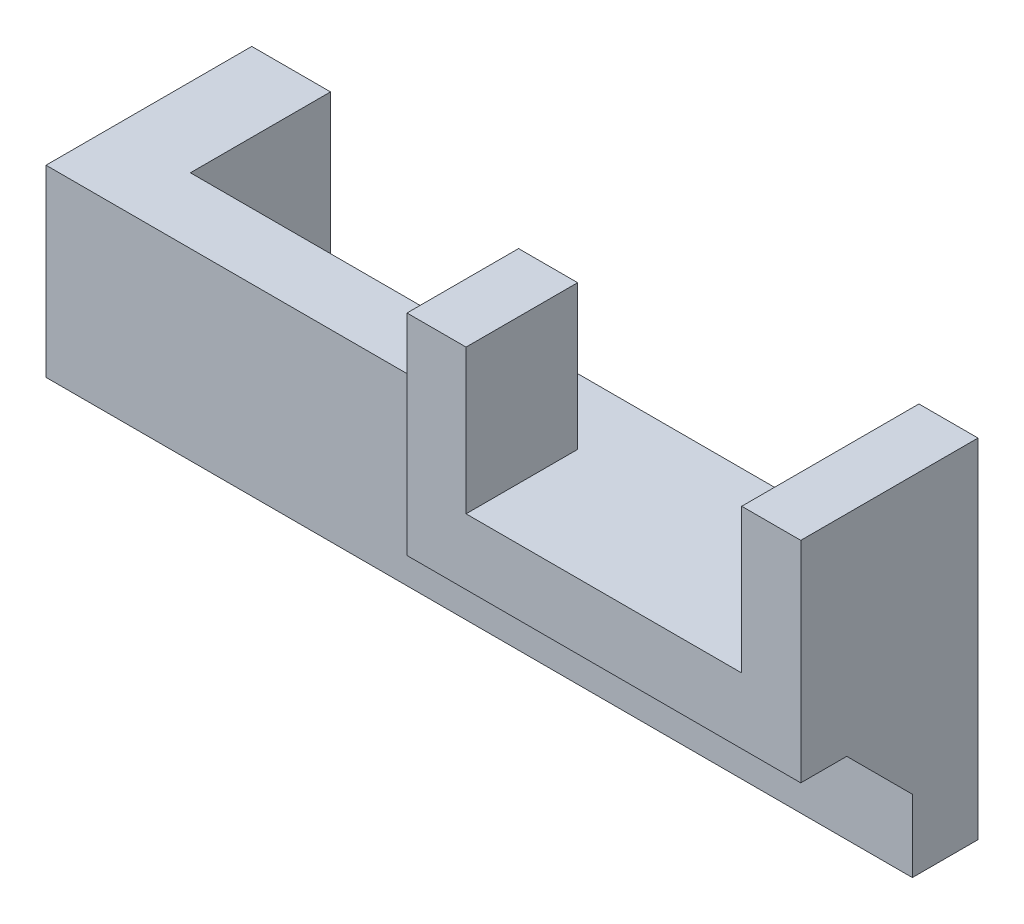
ISO-10303-21;
HEADER;
FILE_DESCRIPTION(('STEP AP214'),'2;1');
FILE_NAME('part.step','',(''),(''),'','','');
FILE_SCHEMA(('AUTOMOTIVE_DESIGN { 1 0 10303 214 1 1 1 1 }'));
ENDSEC;
DATA;
#1=APPLICATION_CONTEXT('core data for automotive mechanical design processes');
#2=APPLICATION_PROTOCOL_DEFINITION('international standard','automotive_design',2000,#1);
#3=PRODUCT_CONTEXT('',#1,'mechanical');
#4=PRODUCT('Part','Part','',(#3));
#5=PRODUCT_RELATED_PRODUCT_CATEGORY('part','',(#4));
#6=PRODUCT_DEFINITION_FORMATION('','',#4);
#7=PRODUCT_DEFINITION_CONTEXT('part definition',#1,'design');
#8=PRODUCT_DEFINITION('design','',#6,#7);
#9=PRODUCT_DEFINITION_SHAPE('','',#8);
#10=(LENGTH_UNIT() NAMED_UNIT(*) SI_UNIT(.MILLI.,.METRE.));
#11=(NAMED_UNIT(*) PLANE_ANGLE_UNIT() SI_UNIT($,.RADIAN.));
#12=(NAMED_UNIT(*) SI_UNIT($,.STERADIAN.) SOLID_ANGLE_UNIT());
#13=UNCERTAINTY_MEASURE_WITH_UNIT(LENGTH_MEASURE(1.E-05),#10,'distance_accuracy_value','');
#14=(GEOMETRIC_REPRESENTATION_CONTEXT(3) GLOBAL_UNCERTAINTY_ASSIGNED_CONTEXT((#13)) GLOBAL_UNIT_ASSIGNED_CONTEXT((#10,
#11,#12)) REPRESENTATION_CONTEXT('',''));
#15=CARTESIAN_POINT('',(0.,0.,0.));
#16=DIRECTION('',(0.,0.,1.));
#17=DIRECTION('',(1.,0.,0.));
#18=AXIS2_PLACEMENT_3D('',#15,#16,#17);
#19=CARTESIAN_POINT('',(132.,0.,-10.));
#20=DIRECTION('',(0.,0.,1.));
#21=DIRECTION('',(1.,0.,0.));
#22=AXIS2_PLACEMENT_3D('',#19,#20,#21);
#23=PLANE('',#22);
#24=DIRECTION('',(-1.,0.,0.));
#25=VECTOR('',#24,1.);
#26=CARTESIAN_POINT('',(132.,28.,-10.));
#27=LINE('',#26,#25);
#28=CARTESIAN_POINT('',(62.,28.,-10.));
#29=VERTEX_POINT('',#28);
#30=CARTESIAN_POINT('',(12.,28.,-10.));
#31=VERTEX_POINT('',#30);
#32=EDGE_CURVE('E216',#29,#31,#27,.T.);
#33=ORIENTED_EDGE('',*,*,#32,.F.);
#34=DIRECTION('',(0.707106781186544,0.707106781186551,0.));
#35=VECTOR('',#34,1.);
#36=CARTESIAN_POINT('',(82.9999999999997,48.9999999999998,-10.));
#37=LINE('',#36,#35);
#38=CARTESIAN_POINT('',(65.,31.,-10.));
#39=VERTEX_POINT('',#38);
#40=EDGE_CURVE('E304',#29,#39,#37,.T.);
#41=ORIENTED_EDGE('',*,*,#40,.T.);
#42=DIRECTION('',(1.,0.,0.));
#43=VECTOR('',#42,1.);
#44=CARTESIAN_POINT('',(132.,31.,-10.));
#45=LINE('',#44,#43);
#46=CARTESIAN_POINT('',(123.,31.,-10.));
#47=VERTEX_POINT('',#46);
#48=EDGE_CURVE('E63',#39,#47,#45,.T.);
#49=ORIENTED_EDGE('',*,*,#48,.T.);
#50=DIRECTION('',(0.,1.,0.));
#51=VECTOR('',#50,1.);
#52=CARTESIAN_POINT('',(123.,0.,-10.));
#53=LINE('',#52,#51);
#54=CARTESIAN_POINT('',(123.,53.,-10.));
#55=VERTEX_POINT('',#54);
#56=EDGE_CURVE('E187',#47,#55,#53,.T.);
#57=ORIENTED_EDGE('',*,*,#56,.T.);
#58=DIRECTION('',(-1.,0.,0.));
#59=VECTOR('',#58,1.);
#60=CARTESIAN_POINT('',(132.,53.,-10.));
#61=LINE('',#60,#59);
#62=CARTESIAN_POINT('',(132.,53.,-10.));
#63=VERTEX_POINT('',#62);
#64=EDGE_CURVE('E196',#63,#55,#61,.T.);
#65=ORIENTED_EDGE('',*,*,#64,.F.);
#66=DIRECTION('',(0.,1.,0.));
#67=VECTOR('',#66,1.);
#68=CARTESIAN_POINT('',(132.,0.,-10.));
#69=LINE('',#68,#67);
#70=CARTESIAN_POINT('',(132.,0.,-10.));
#71=VERTEX_POINT('',#70);
#72=EDGE_CURVE('E213',#71,#63,#69,.T.);
#73=ORIENTED_EDGE('',*,*,#72,.F.);
#74=DIRECTION('',(-1.,0.,0.));
#75=VECTOR('',#74,1.);
#76=CARTESIAN_POINT('',(132.,0.,-10.));
#77=LINE('',#76,#75);
#78=CARTESIAN_POINT('',(12.,0.,-10.));
#79=VERTEX_POINT('',#78);
#80=EDGE_CURVE('E222',#71,#79,#77,.T.);
#81=ORIENTED_EDGE('',*,*,#80,.T.);
#82=DIRECTION('',(0.,1.,0.));
#83=VECTOR('',#82,1.);
#84=CARTESIAN_POINT('',(12.,0.,-10.));
#85=LINE('',#84,#83);
#86=EDGE_CURVE('E204',#79,#31,#85,.T.);
#87=ORIENTED_EDGE('',*,*,#86,.T.);
#88=EDGE_LOOP('',(#33,#41,#49,#57,#65,#73,#81,#87));
#89=FACE_BOUND('',#88,.T.);
#90=ADVANCED_FACE('F41',(#89),#23,.F.);
#91=CARTESIAN_POINT('',(72.,28.,-10.));
#92=DIRECTION('',(-1.,0.,0.));
#93=DIRECTION('',(0.,0.,1.));
#94=AXIS2_PLACEMENT_3D('',#91,#92,#93);
#95=PLANE('',#94);
#96=DIRECTION('',(0.,-1.,0.));
#97=VECTOR('',#96,1.);
#98=CARTESIAN_POINT('',(72.,0.,0.));
#99=LINE('',#98,#97);
#100=CARTESIAN_POINT('',(72.,53.,0.));
#101=VERTEX_POINT('',#100);
#102=CARTESIAN_POINT('',(72.,38.0000000000001,0.));
#103=VERTEX_POINT('',#102);
#104=EDGE_CURVE('E167',#101,#103,#99,.T.);
#105=ORIENTED_EDGE('',*,*,#104,.T.);
#106=DIRECTION('',(0.,0.,1.));
#107=VECTOR('',#106,1.);
#108=CARTESIAN_POINT('',(72.,38.0000000000001,-10.));
#109=LINE('',#108,#107);
#110=CARTESIAN_POINT('',(72.,38.0000000000001,10.0000000000001));
#111=VERTEX_POINT('',#110);
#112=EDGE_CURVE('E290',#103,#111,#109,.T.);
#113=ORIENTED_EDGE('',*,*,#112,.T.);
#114=DIRECTION('',(0.,-1.,0.));
#115=VECTOR('',#114,1.);
#116=CARTESIAN_POINT('',(72.,28.,10.0000000000001));
#117=LINE('',#116,#115);
#118=CARTESIAN_POINT('',(72.,21.,10.));
#119=VERTEX_POINT('',#118);
#120=EDGE_CURVE('E273',#111,#119,#117,.T.);
#121=ORIENTED_EDGE('',*,*,#120,.T.);
#122=DIRECTION('',(0.,0.,-1.));
#123=VECTOR('',#122,1.);
#124=CARTESIAN_POINT('',(72.,21.,17.));
#125=LINE('',#124,#123);
#126=CARTESIAN_POINT('',(72.,21.,17.));
#127=VERTEX_POINT('',#126);
#128=EDGE_CURVE('E183',#127,#119,#125,.T.);
#129=ORIENTED_EDGE('',*,*,#128,.F.);
#130=DIRECTION('',(0.,-1.,0.));
#131=VECTOR('',#130,1.);
#132=CARTESIAN_POINT('',(72.,0.,17.));
#133=LINE('',#132,#131);
#134=CARTESIAN_POINT('',(72.,53.,17.));
#135=VERTEX_POINT('',#134);
#136=EDGE_CURVE('E294',#135,#127,#133,.T.);
#137=ORIENTED_EDGE('',*,*,#136,.F.);
#138=DIRECTION('',(0.,0.,1.));
#139=VECTOR('',#138,1.);
#140=CARTESIAN_POINT('',(72.,53.,-10.));
#141=LINE('',#140,#139);
#142=EDGE_CURVE('E201',#101,#135,#141,.T.);
#143=ORIENTED_EDGE('',*,*,#142,.F.);
#144=EDGE_LOOP('',(#105,#113,#121,#129,#137,#143));
#145=FACE_BOUND('',#144,.T.);
#146=ADVANCED_FACE('F317',(#145),#95,.T.);
#147=CARTESIAN_POINT('',(132.,53.,-10.));
#148=DIRECTION('',(0.,1.,0.));
#149=DIRECTION('',(-1.,0.,0.));
#150=AXIS2_PLACEMENT_3D('',#147,#148,#149);
#151=PLANE('',#150);
#152=DIRECTION('',(0.,0.,1.));
#153=VECTOR('',#152,1.);
#154=CARTESIAN_POINT('',(81.,53.,-10.));
#155=LINE('',#154,#153);
#156=CARTESIAN_POINT('',(81.,53.,0.));
#157=VERTEX_POINT('',#156);
#158=CARTESIAN_POINT('',(81.,53.,17.));
#159=VERTEX_POINT('',#158);
#160=EDGE_CURVE('E265',#157,#159,#155,.T.);
#161=ORIENTED_EDGE('',*,*,#160,.F.);
#162=DIRECTION('',(-1.,0.,0.));
#163=VECTOR('',#162,1.);
#164=CARTESIAN_POINT('',(81.,53.,0.));
#165=LINE('',#164,#163);
#166=EDGE_CURVE('E162',#157,#101,#165,.T.);
#167=ORIENTED_EDGE('',*,*,#166,.T.);
#168=ORIENTED_EDGE('',*,*,#142,.T.);
#169=DIRECTION('',(-1.,0.,0.));
#170=VECTOR('',#169,1.);
#171=CARTESIAN_POINT('',(0.,53.,17.));
#172=LINE('',#171,#170);
#173=EDGE_CURVE('E347',#159,#135,#172,.T.);
#174=ORIENTED_EDGE('',*,*,#173,.F.);
#175=EDGE_LOOP('',(#161,#167,#168,#174));
#176=FACE_BOUND('',#175,.T.);
#177=ADVANCED_FACE('F414',(#176),#151,.T.);
#178=CARTESIAN_POINT('',(81.,53.,-31.35));
#179=DIRECTION('',(-1.,0.,0.));
#180=DIRECTION('',(0.,0.,1.));
#181=AXIS2_PLACEMENT_3D('',#178,#179,#180);
#182=PLANE('',#181);
#183=DIRECTION('',(0.,-1.,0.));
#184=VECTOR('',#183,1.);
#185=CARTESIAN_POINT('',(81.,0.,0.));
#186=LINE('',#185,#184);
#187=CARTESIAN_POINT('',(81.,31.,0.));
#188=VERTEX_POINT('',#187);
#189=EDGE_CURVE('E159',#157,#188,#186,.T.);
#190=ORIENTED_EDGE('',*,*,#189,.F.);
#191=ORIENTED_EDGE('',*,*,#160,.T.);
#192=DIRECTION('',(0.,1.,0.));
#193=VECTOR('',#192,1.);
#194=CARTESIAN_POINT('',(81.,0.,17.));
#195=LINE('',#194,#193);
#196=CARTESIAN_POINT('',(81.,31.,17.));
#197=VERTEX_POINT('',#196);
#198=EDGE_CURVE('E180',#197,#159,#195,.T.);
#199=ORIENTED_EDGE('',*,*,#198,.F.);
#200=DIRECTION('',(0.,0.,1.));
#201=VECTOR('',#200,1.);
#202=CARTESIAN_POINT('',(81.,31.,-31.35));
#203=LINE('',#202,#201);
#204=EDGE_CURVE('E171',#188,#197,#203,.T.);
#205=ORIENTED_EDGE('',*,*,#204,.F.);
#206=EDGE_LOOP('',(#190,#191,#199,#205));
#207=FACE_BOUND('',#206,.T.);
#208=ADVANCED_FACE('F178',(#207),#182,.F.);
#209=CARTESIAN_POINT('',(12.,0.,0.));
#210=DIRECTION('',(0.,0.,-1.));
#211=DIRECTION('',(-1.,0.,0.));
#212=AXIS2_PLACEMENT_3D('',#209,#210,#211);
#213=PLANE('',#212);
#214=DIRECTION('',(-1.,0.,0.));
#215=VECTOR('',#214,1.);
#216=CARTESIAN_POINT('',(72.,11.0000000000001,0.));
#217=LINE('',#216,#215);
#218=CARTESIAN_POINT('',(132.,11.0000000000001,0.));
#219=VERTEX_POINT('',#218);
#220=CARTESIAN_POINT('',(62.0000000000001,11.0000000000001,0.));
#221=VERTEX_POINT('',#220);
#222=EDGE_CURVE('E277',#219,#221,#217,.T.);
#223=ORIENTED_EDGE('',*,*,#222,.T.);
#224=DIRECTION('',(0.,1.,0.));
#225=VECTOR('',#224,1.);
#226=CARTESIAN_POINT('',(62.0000000000001,0.,0.));
#227=LINE('',#226,#225);
#228=CARTESIAN_POINT('',(62.0000000000001,28.,0.));
#229=VERTEX_POINT('',#228);
#230=EDGE_CURVE('E280',#221,#229,#227,.T.);
#231=ORIENTED_EDGE('',*,*,#230,.T.);
#232=DIRECTION('',(-1.,0.,0.));
#233=VECTOR('',#232,1.);
#234=CARTESIAN_POINT('',(12.,28.,0.));
#235=LINE('',#234,#233);
#236=CARTESIAN_POINT('',(0.,28.,0.));
#237=VERTEX_POINT('',#236);
#238=EDGE_CURVE('E238',#229,#237,#235,.T.);
#239=ORIENTED_EDGE('',*,*,#238,.T.);
#240=DIRECTION('',(0.,-1.,0.));
#241=VECTOR('',#240,1.);
#242=CARTESIAN_POINT('',(0.,0.,0.));
#243=LINE('',#242,#241);
#244=CARTESIAN_POINT('',(0.,0.,0.));
#245=VERTEX_POINT('',#244);
#246=EDGE_CURVE('E226',#237,#245,#243,.T.);
#247=ORIENTED_EDGE('',*,*,#246,.T.);
#248=DIRECTION('',(-1.,0.,0.));
#249=VECTOR('',#248,1.);
#250=CARTESIAN_POINT('',(12.,0.,0.));
#251=LINE('',#250,#249);
#252=CARTESIAN_POINT('',(132.,0.,0.));
#253=VERTEX_POINT('',#252);
#254=EDGE_CURVE('E261',#253,#245,#251,.T.);
#255=ORIENTED_EDGE('',*,*,#254,.F.);
#256=DIRECTION('',(0.,-1.,0.));
#257=VECTOR('',#256,1.);
#258=CARTESIAN_POINT('',(132.,0.,0.));
#259=LINE('',#258,#257);
#260=EDGE_CURVE('E207',#219,#253,#259,.T.);
#261=ORIENTED_EDGE('',*,*,#260,.F.);
#262=EDGE_LOOP('',(#223,#231,#239,#247,#255,#261));
#263=FACE_BOUND('',#262,.T.);
#264=ADVANCED_FACE('F367',(#263),#213,.F.);
#265=DIRECTION('',(0.,0.,-1.));
#266=VECTOR('',#265,1.);
#267=CARTESIAN_POINT('',(123.,53.,-10.));
#268=LINE('',#267,#266);
#269=CARTESIAN_POINT('',(123.,53.,17.));
#270=VERTEX_POINT('',#269);
#271=EDGE_CURVE('E268',#270,#55,#268,.T.);
#272=ORIENTED_EDGE('',*,*,#271,.F.);
#273=DIRECTION('',(-1.,0.,0.));
#274=VECTOR('',#273,1.);
#275=CARTESIAN_POINT('',(0.,53.,17.));
#276=LINE('',#275,#274);
#277=CARTESIAN_POINT('',(132.,53.,17.));
#278=VERTEX_POINT('',#277);
#279=EDGE_CURVE('E334',#278,#270,#276,.T.);
#280=ORIENTED_EDGE('',*,*,#279,.F.);
#281=DIRECTION('',(0.,0.,1.));
#282=VECTOR('',#281,1.);
#283=CARTESIAN_POINT('',(132.,53.,-10.));
#284=LINE('',#283,#282);
#285=EDGE_CURVE('E200',#63,#278,#284,.T.);
#286=ORIENTED_EDGE('',*,*,#285,.F.);
#287=ORIENTED_EDGE('',*,*,#64,.T.);
#288=EDGE_LOOP('',(#272,#280,#286,#287));
#289=FACE_BOUND('',#288,.T.);
#290=ADVANCED_FACE('F391',(#289),#151,.T.);
#291=CARTESIAN_POINT('',(12.,28.,0.));
#292=DIRECTION('',(0.,-1.,0.));
#293=DIRECTION('',(0.,0.,-1.));
#294=AXIS2_PLACEMENT_3D('',#291,#292,#293);
#295=PLANE('',#294);
#296=ORIENTED_EDGE('',*,*,#238,.F.);
#297=DIRECTION('',(0.,0.,-1.));
#298=VECTOR('',#297,1.);
#299=CARTESIAN_POINT('',(62.,28.,0.));
#300=LINE('',#299,#298);
#301=EDGE_CURVE('E298',#229,#29,#300,.T.);
#302=ORIENTED_EDGE('',*,*,#301,.T.);
#303=ORIENTED_EDGE('',*,*,#32,.T.);
#304=DIRECTION('',(0.,0.,1.));
#305=VECTOR('',#304,1.);
#306=CARTESIAN_POINT('',(12.,28.,0.));
#307=LINE('',#306,#305);
#308=CARTESIAN_POINT('',(12.,28.,-31.35));
#309=VERTEX_POINT('',#308);
#310=EDGE_CURVE('E234',#309,#31,#307,.T.);
#311=ORIENTED_EDGE('',*,*,#310,.F.);
#312=DIRECTION('',(-1.,0.,0.));
#313=VECTOR('',#312,1.);
#314=CARTESIAN_POINT('',(12.,28.,-31.35));
#315=LINE('',#314,#313);
#316=CARTESIAN_POINT('',(0.,28.,-31.35));
#317=VERTEX_POINT('',#316);
#318=EDGE_CURVE('E253',#309,#317,#315,.T.);
#319=ORIENTED_EDGE('',*,*,#318,.T.);
#320=DIRECTION('',(0.,0.,1.));
#321=VECTOR('',#320,1.);
#322=CARTESIAN_POINT('',(0.,28.,0.));
#323=LINE('',#322,#321);
#324=EDGE_CURVE('E231',#317,#237,#323,.T.);
#325=ORIENTED_EDGE('',*,*,#324,.T.);
#326=EDGE_LOOP('',(#296,#302,#303,#311,#319,#325));
#327=FACE_BOUND('',#326,.T.);
#328=ADVANCED_FACE('F373',(#327),#295,.F.);
#329=CARTESIAN_POINT('',(12.,0.,0.));
#330=DIRECTION('',(-1.,0.,0.));
#331=DIRECTION('',(0.,0.,1.));
#332=AXIS2_PLACEMENT_3D('',#329,#330,#331);
#333=PLANE('',#332);
#334=ORIENTED_EDGE('',*,*,#86,.F.);
#335=DIRECTION('',(0.,0.,-1.));
#336=VECTOR('',#335,1.);
#337=CARTESIAN_POINT('',(12.,0.,0.));
#338=LINE('',#337,#336);
#339=CARTESIAN_POINT('',(12.,0.,-31.35));
#340=VERTEX_POINT('',#339);
#341=EDGE_CURVE('E227',#79,#340,#338,.T.);
#342=ORIENTED_EDGE('',*,*,#341,.T.);
#343=DIRECTION('',(0.,1.,0.));
#344=VECTOR('',#343,1.);
#345=CARTESIAN_POINT('',(12.,0.,-31.35));
#346=LINE('',#345,#344);
#347=EDGE_CURVE('E230',#340,#309,#346,.T.);
#348=ORIENTED_EDGE('',*,*,#347,.T.);
#349=ORIENTED_EDGE('',*,*,#310,.T.);
#350=EDGE_LOOP('',(#334,#342,#348,#349));
#351=FACE_BOUND('',#350,.T.);
#352=ADVANCED_FACE('F419',(#351),#333,.F.);
#353=CARTESIAN_POINT('',(12.,0.,0.));
#354=DIRECTION('',(0.,1.,0.));
#355=DIRECTION('',(0.,0.,1.));
#356=AXIS2_PLACEMENT_3D('',#353,#354,#355);
#357=PLANE('',#356);
#358=DIRECTION('',(0.,0.,-1.));
#359=VECTOR('',#358,1.);
#360=CARTESIAN_POINT('',(0.,0.,0.));
#361=LINE('',#360,#359);
#362=CARTESIAN_POINT('',(0.,0.,-31.35));
#363=VERTEX_POINT('',#362);
#364=EDGE_CURVE('E242',#245,#363,#361,.T.);
#365=ORIENTED_EDGE('',*,*,#364,.T.);
#366=DIRECTION('',(-1.,0.,0.));
#367=VECTOR('',#366,1.);
#368=CARTESIAN_POINT('',(12.,0.,-31.35));
#369=LINE('',#368,#367);
#370=EDGE_CURVE('E257',#340,#363,#369,.T.);
#371=ORIENTED_EDGE('',*,*,#370,.F.);
#372=ORIENTED_EDGE('',*,*,#341,.F.);
#373=ORIENTED_EDGE('',*,*,#80,.F.);
#374=DIRECTION('',(0.,0.,-1.));
#375=VECTOR('',#374,1.);
#376=CARTESIAN_POINT('',(132.,0.,0.));
#377=LINE('',#376,#375);
#378=EDGE_CURVE('E210',#253,#71,#377,.T.);
#379=ORIENTED_EDGE('',*,*,#378,.F.);
#380=ORIENTED_EDGE('',*,*,#254,.T.);
#381=EDGE_LOOP('',(#365,#371,#372,#373,#379,#380));
#382=FACE_BOUND('',#381,.T.);
#383=ADVANCED_FACE('F383',(#382),#357,.F.);
#384=CARTESIAN_POINT('',(12.,0.,-31.35));
#385=DIRECTION('',(0.,0.,1.));
#386=DIRECTION('',(1.,0.,0.));
#387=AXIS2_PLACEMENT_3D('',#384,#385,#386);
#388=PLANE('',#387);
#389=DIRECTION('',(0.,1.,0.));
#390=VECTOR('',#389,1.);
#391=CARTESIAN_POINT('',(0.,0.,-31.35));
#392=LINE('',#391,#390);
#393=EDGE_CURVE('E245',#363,#317,#392,.T.);
#394=ORIENTED_EDGE('',*,*,#393,.T.);
#395=ORIENTED_EDGE('',*,*,#318,.F.);
#396=ORIENTED_EDGE('',*,*,#347,.F.);
#397=ORIENTED_EDGE('',*,*,#370,.T.);
#398=EDGE_LOOP('',(#394,#395,#396,#397));
#399=FACE_BOUND('',#398,.T.);
#400=ADVANCED_FACE('F425',(#399),#388,.F.);
#401=CARTESIAN_POINT('',(0.,0.,0.));
#402=DIRECTION('',(-1.,0.,0.));
#403=DIRECTION('',(0.,0.,1.));
#404=AXIS2_PLACEMENT_3D('',#401,#402,#403);
#405=PLANE('',#404);
#406=ORIENTED_EDGE('',*,*,#246,.F.);
#407=ORIENTED_EDGE('',*,*,#324,.F.);
#408=ORIENTED_EDGE('',*,*,#393,.F.);
#409=ORIENTED_EDGE('',*,*,#364,.F.);
#410=EDGE_LOOP('',(#406,#407,#408,#409));
#411=FACE_BOUND('',#410,.T.);
#412=ADVANCED_FACE('F379',(#411),#405,.T.);
#413=CARTESIAN_POINT('',(132.,0.,0.));
#414=DIRECTION('',(-1.,0.,0.));
#415=DIRECTION('',(0.,0.,1.));
#416=AXIS2_PLACEMENT_3D('',#413,#414,#415);
#417=PLANE('',#416);
#418=ORIENTED_EDGE('',*,*,#285,.T.);
#419=DIRECTION('',(0.,1.,0.));
#420=VECTOR('',#419,1.);
#421=CARTESIAN_POINT('',(132.,0.,17.));
#422=LINE('',#421,#420);
#423=CARTESIAN_POINT('',(132.,21.,17.));
#424=VERTEX_POINT('',#423);
#425=EDGE_CURVE('E330',#424,#278,#422,.T.);
#426=ORIENTED_EDGE('',*,*,#425,.F.);
#427=DIRECTION('',(0.,0.,-1.));
#428=VECTOR('',#427,1.);
#429=CARTESIAN_POINT('',(132.,21.,17.));
#430=LINE('',#429,#428);
#431=CARTESIAN_POINT('',(132.,21.,10.));
#432=VERTEX_POINT('',#431);
#433=EDGE_CURVE('E190',#424,#432,#430,.T.);
#434=ORIENTED_EDGE('',*,*,#433,.T.);
#435=DIRECTION('',(0.,0.707106781186544,0.707106781186551));
#436=VECTOR('',#435,1.);
#437=CARTESIAN_POINT('',(132.,5.50000000000008,-5.50000000000003));
#438=LINE('',#437,#436);
#439=EDGE_CURVE('E287',#432,#219,#438,.F.);
#440=ORIENTED_EDGE('',*,*,#439,.T.);
#441=ORIENTED_EDGE('',*,*,#260,.T.);
#442=ORIENTED_EDGE('',*,*,#378,.T.);
#443=ORIENTED_EDGE('',*,*,#72,.T.);
#444=EDGE_LOOP('',(#418,#426,#434,#440,#441,#442,#443));
#445=FACE_BOUND('',#444,.T.);
#446=ADVANCED_FACE('F357',(#445),#417,.F.);
#447=CARTESIAN_POINT('',(81.,31.,-31.35));
#448=DIRECTION('',(0.,-1.,0.));
#449=DIRECTION('',(1.,0.,0.));
#450=AXIS2_PLACEMENT_3D('',#447,#448,#449);
#451=PLANE('',#450);
#452=ORIENTED_EDGE('',*,*,#48,.F.);
#453=DIRECTION('',(0.,0.,1.));
#454=VECTOR('',#453,1.);
#455=CARTESIAN_POINT('',(65.,31.,-31.35));
#456=LINE('',#455,#454);
#457=CARTESIAN_POINT('',(65.,31.,0.));
#458=VERTEX_POINT('',#457);
#459=EDGE_CURVE('E50',#39,#458,#456,.T.);
#460=ORIENTED_EDGE('',*,*,#459,.T.);
#461=DIRECTION('',(-1.,0.,0.));
#462=VECTOR('',#461,1.);
#463=CARTESIAN_POINT('',(81.,31.,0.));
#464=LINE('',#463,#462);
#465=EDGE_CURVE('E56',#188,#458,#464,.T.);
#466=ORIENTED_EDGE('',*,*,#465,.F.);
#467=ORIENTED_EDGE('',*,*,#204,.T.);
#468=DIRECTION('',(-1.,0.,0.));
#469=VECTOR('',#468,1.);
#470=CARTESIAN_POINT('',(0.,31.,17.));
#471=LINE('',#470,#469);
#472=CARTESIAN_POINT('',(123.,31.,17.));
#473=VERTEX_POINT('',#472);
#474=EDGE_CURVE('E342',#473,#197,#471,.T.);
#475=ORIENTED_EDGE('',*,*,#474,.F.);
#476=DIRECTION('',(0.,0.,1.));
#477=VECTOR('',#476,1.);
#478=CARTESIAN_POINT('',(123.,31.,-31.35));
#479=LINE('',#478,#477);
#480=EDGE_CURVE('E182',#47,#473,#479,.T.);
#481=ORIENTED_EDGE('',*,*,#480,.F.);
#482=EDGE_LOOP('',(#452,#460,#466,#467,#475,#481));
#483=FACE_BOUND('',#482,.T.);
#484=ADVANCED_FACE('F169',(#483),#451,.F.);
#485=CARTESIAN_POINT('',(123.,31.,-31.35));
#486=DIRECTION('',(1.,0.,0.));
#487=DIRECTION('',(0.,0.,-1.));
#488=AXIS2_PLACEMENT_3D('',#485,#486,#487);
#489=PLANE('',#488);
#490=ORIENTED_EDGE('',*,*,#480,.T.);
#491=DIRECTION('',(0.,-1.,0.));
#492=VECTOR('',#491,1.);
#493=CARTESIAN_POINT('',(123.,0.,17.));
#494=LINE('',#493,#492);
#495=EDGE_CURVE('E338',#270,#473,#494,.T.);
#496=ORIENTED_EDGE('',*,*,#495,.F.);
#497=ORIENTED_EDGE('',*,*,#271,.T.);
#498=ORIENTED_EDGE('',*,*,#56,.F.);
#499=EDGE_LOOP('',(#490,#496,#497,#498));
#500=FACE_BOUND('',#499,.T.);
#501=ADVANCED_FACE('F393',(#500),#489,.F.);
#502=CARTESIAN_POINT('',(0.,21.,17.));
#503=DIRECTION('',(0.,1.,0.));
#504=DIRECTION('',(0.,0.,1.));
#505=AXIS2_PLACEMENT_3D('',#502,#503,#504);
#506=PLANE('',#505);
#507=ORIENTED_EDGE('',*,*,#128,.T.);
#508=DIRECTION('',(1.,0.,0.));
#509=VECTOR('',#508,1.);
#510=CARTESIAN_POINT('',(132.,21.,10.));
#511=LINE('',#510,#509);
#512=EDGE_CURVE('E284',#119,#432,#511,.T.);
#513=ORIENTED_EDGE('',*,*,#512,.T.);
#514=ORIENTED_EDGE('',*,*,#433,.F.);
#515=DIRECTION('',(1.,0.,0.));
#516=VECTOR('',#515,1.);
#517=CARTESIAN_POINT('',(0.,21.,17.));
#518=LINE('',#517,#516);
#519=EDGE_CURVE('E327',#127,#424,#518,.T.);
#520=ORIENTED_EDGE('',*,*,#519,.F.);
#521=EDGE_LOOP('',(#507,#513,#514,#520));
#522=FACE_BOUND('',#521,.T.);
#523=ADVANCED_FACE('F399',(#522),#506,.F.);
#524=CARTESIAN_POINT('',(0.,0.,17.));
#525=DIRECTION('',(0.,0.,1.));
#526=DIRECTION('',(1.,0.,0.));
#527=AXIS2_PLACEMENT_3D('',#524,#525,#526);
#528=PLANE('',#527);
#529=ORIENTED_EDGE('',*,*,#136,.T.);
#530=ORIENTED_EDGE('',*,*,#519,.T.);
#531=ORIENTED_EDGE('',*,*,#425,.T.);
#532=ORIENTED_EDGE('',*,*,#279,.T.);
#533=ORIENTED_EDGE('',*,*,#495,.T.);
#534=ORIENTED_EDGE('',*,*,#474,.T.);
#535=ORIENTED_EDGE('',*,*,#198,.T.);
#536=ORIENTED_EDGE('',*,*,#173,.T.);
#537=EDGE_LOOP('',(#529,#530,#531,#532,#533,#534,#535,#536));
#538=FACE_BOUND('',#537,.T.);
#539=ADVANCED_FACE('F396',(#538),#528,.T.);
#540=CARTESIAN_POINT('',(0.,21.,10.));
#541=DIRECTION('',(0.,-0.707106781186551,0.707106781186544));
#542=DIRECTION('',(-1.,0.,0.));
#543=AXIS2_PLACEMENT_3D('',#540,#541,#542);
#544=PLANE('',#543);
#545=ORIENTED_EDGE('',*,*,#439,.F.);
#546=ORIENTED_EDGE('',*,*,#512,.F.);
#547=DIRECTION('',(0.577350269189624,0.577350269189624,0.57735026918963));
#548=VECTOR('',#547,1.);
#549=CARTESIAN_POINT('',(48.0000000000002,-2.99999999999984,-14.));
#550=LINE('',#549,#548);
#551=EDGE_CURVE('E291',#221,#119,#550,.T.);
#552=ORIENTED_EDGE('',*,*,#551,.F.);
#553=ORIENTED_EDGE('',*,*,#222,.F.);
#554=EDGE_LOOP('',(#545,#546,#552,#553));
#555=FACE_BOUND('',#554,.T.);
#556=ADVANCED_FACE('F363',(#555),#544,.T.);
#557=CARTESIAN_POINT('',(72.,28.,10.0000000000001));
#558=DIRECTION('',(0.707106781186551,0.,-0.707106781186544));
#559=DIRECTION('',(0.,-1.,0.));
#560=AXIS2_PLACEMENT_3D('',#557,#558,#559);
#561=PLANE('',#560);
#562=ORIENTED_EDGE('',*,*,#120,.F.);
#563=DIRECTION('',(-0.577350269189622,-0.577350269189628,-0.577350269189628));
#564=VECTOR('',#563,1.);
#565=CARTESIAN_POINT('',(68.6666666666667,34.6666666666667,6.66666666666667));
#566=LINE('',#565,#564);
#567=EDGE_CURVE('E301',#111,#229,#566,.T.);
#568=ORIENTED_EDGE('',*,*,#567,.T.);
#569=ORIENTED_EDGE('',*,*,#230,.F.);
#570=ORIENTED_EDGE('',*,*,#551,.T.);
#571=EDGE_LOOP('',(#562,#568,#569,#570));
#572=FACE_BOUND('',#571,.T.);
#573=ADVANCED_FACE('F371',(#572),#561,.F.);
#574=CARTESIAN_POINT('',(81.,0.,0.));
#575=DIRECTION('',(0.,0.,-1.));
#576=DIRECTION('',(0.,1.,0.));
#577=AXIS2_PLACEMENT_3D('',#574,#575,#576);
#578=PLANE('',#577);
#579=ORIENTED_EDGE('',*,*,#104,.F.);
#580=ORIENTED_EDGE('',*,*,#166,.F.);
#581=ORIENTED_EDGE('',*,*,#189,.T.);
#582=ORIENTED_EDGE('',*,*,#465,.T.);
#583=DIRECTION('',(0.707106781186544,0.707106781186551,0.));
#584=VECTOR('',#583,1.);
#585=CARTESIAN_POINT('',(72.,38.0000000000001,0.));
#586=LINE('',#585,#584);
#587=EDGE_CURVE('E11',#458,#103,#586,.T.);
#588=ORIENTED_EDGE('',*,*,#587,.T.);
#589=EDGE_LOOP('',(#579,#580,#581,#582,#588));
#590=FACE_BOUND('',#589,.T.);
#591=ADVANCED_FACE('F160',(#590),#578,.T.);
#592=CARTESIAN_POINT('',(72.,38.0000000000001,-10.));
#593=DIRECTION('',(0.707106781186551,-0.707106781186544,0.));
#594=DIRECTION('',(0.,0.,1.));
#595=AXIS2_PLACEMENT_3D('',#592,#593,#594);
#596=PLANE('',#595);
#597=ORIENTED_EDGE('',*,*,#40,.F.);
#598=ORIENTED_EDGE('',*,*,#301,.F.);
#599=ORIENTED_EDGE('',*,*,#567,.F.);
#600=ORIENTED_EDGE('',*,*,#112,.F.);
#601=ORIENTED_EDGE('',*,*,#587,.F.);
#602=ORIENTED_EDGE('',*,*,#459,.F.);
#603=EDGE_LOOP('',(#597,#598,#599,#600,#601,#602));
#604=FACE_BOUND('',#603,.T.);
#605=ADVANCED_FACE('F43',(#604),#596,.F.);
#606=CLOSED_SHELL('',(#90,#146,#177,#208,#264,#290,#328,#352,#383,#400,#412,#446,#484,#501,#523,
#539,#556,#573,#591,#605));
#607=MANIFOLD_SOLID_BREP('B2',#606);
#608=ADVANCED_BREP_SHAPE_REPRESENTATION('',(#18,#607),#14);
#609=SHAPE_DEFINITION_REPRESENTATION(#9,#608);
ENDSEC;
END-ISO-10303-21;
